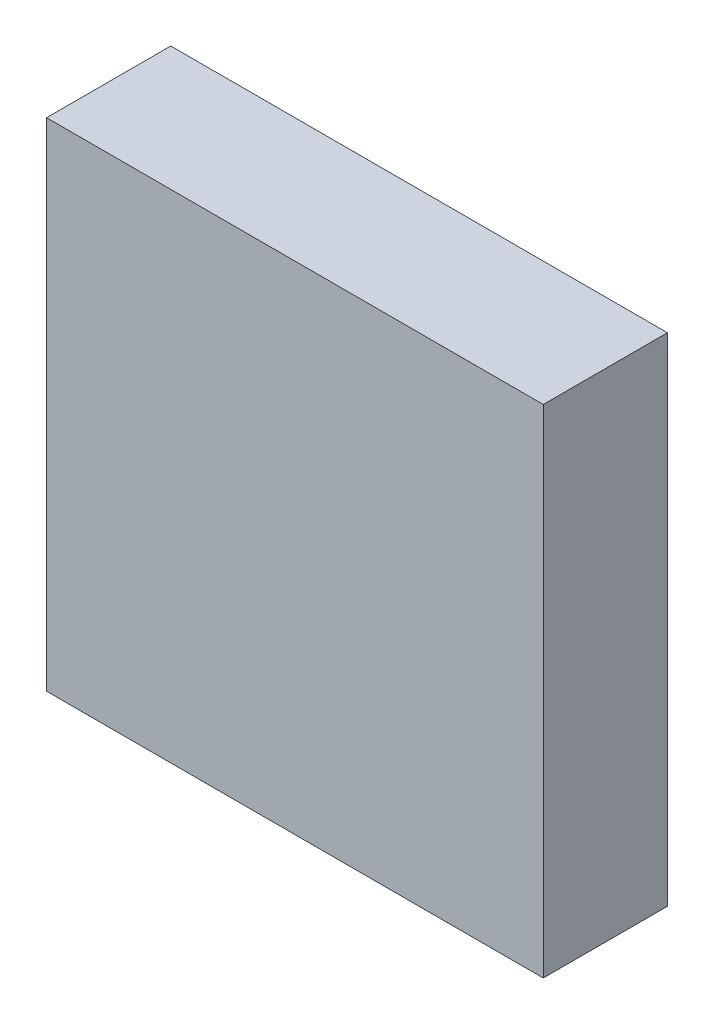
ISO-10303-21;
HEADER;
FILE_DESCRIPTION(('STEP AP214'),'2;1');
FILE_NAME('part.step','',(''),(''),'','','');
FILE_SCHEMA(('AUTOMOTIVE_DESIGN { 1 0 10303 214 1 1 1 1 }'));
ENDSEC;
DATA;
#1=APPLICATION_CONTEXT('core data for automotive mechanical design processes');
#2=APPLICATION_PROTOCOL_DEFINITION('international standard','automotive_design',2000,#1);
#3=PRODUCT_CONTEXT('',#1,'mechanical');
#4=PRODUCT('Part','Part','',(#3));
#5=PRODUCT_RELATED_PRODUCT_CATEGORY('part','',(#4));
#6=PRODUCT_DEFINITION_FORMATION('','',#4);
#7=PRODUCT_DEFINITION_CONTEXT('part definition',#1,'design');
#8=PRODUCT_DEFINITION('design','',#6,#7);
#9=PRODUCT_DEFINITION_SHAPE('','',#8);
#10=(LENGTH_UNIT() NAMED_UNIT(*) SI_UNIT(.MILLI.,.METRE.));
#11=(NAMED_UNIT(*) PLANE_ANGLE_UNIT() SI_UNIT($,.RADIAN.));
#12=(NAMED_UNIT(*) SI_UNIT($,.STERADIAN.) SOLID_ANGLE_UNIT());
#13=UNCERTAINTY_MEASURE_WITH_UNIT(LENGTH_MEASURE(1.E-05),#10,'distance_accuracy_value','');
#14=(GEOMETRIC_REPRESENTATION_CONTEXT(3) GLOBAL_UNCERTAINTY_ASSIGNED_CONTEXT((#13)) GLOBAL_UNIT_ASSIGNED_CONTEXT((#10,
#11,#12)) REPRESENTATION_CONTEXT('',''));
#15=CARTESIAN_POINT('',(0.,0.,0.));
#16=DIRECTION('',(0.,0.,1.));
#17=DIRECTION('',(1.,0.,0.));
#18=AXIS2_PLACEMENT_3D('',#15,#16,#17);
#19=CARTESIAN_POINT('',(-1000.,-1000.,500.));
#20=DIRECTION('',(1.,0.,0.));
#21=DIRECTION('',(0.,0.,-1.));
#22=AXIS2_PLACEMENT_3D('',#19,#20,#21);
#23=PLANE('',#22);
#24=DIRECTION('',(0.,-1.,0.));
#25=VECTOR('',#24,1.);
#26=CARTESIAN_POINT('',(-1000.,-1000.,0.));
#27=LINE('',#26,#25);
#28=CARTESIAN_POINT('',(-1000.,999.999999999999,0.));
#29=VERTEX_POINT('',#28);
#30=CARTESIAN_POINT('',(-1000.,-1000.,0.));
#31=VERTEX_POINT('',#30);
#32=EDGE_CURVE('E113',#29,#31,#27,.T.);
#33=ORIENTED_EDGE('',*,*,#32,.T.);
#34=DIRECTION('',(0.,0.,-1.));
#35=VECTOR('',#34,1.);
#36=CARTESIAN_POINT('',(-1000.,-1000.,500.));
#37=LINE('',#36,#35);
#38=CARTESIAN_POINT('',(-1000.,-1000.,500.));
#39=VERTEX_POINT('',#38);
#40=EDGE_CURVE('E11',#39,#31,#37,.T.);
#41=ORIENTED_EDGE('',*,*,#40,.F.);
#42=DIRECTION('',(0.,-1.,0.));
#43=VECTOR('',#42,1.);
#44=CARTESIAN_POINT('',(-1000.,-1000.,500.));
#45=LINE('',#44,#43);
#46=CARTESIAN_POINT('',(-1000.,999.999999999999,500.));
#47=VERTEX_POINT('',#46);
#48=EDGE_CURVE('E97',#47,#39,#45,.T.);
#49=ORIENTED_EDGE('',*,*,#48,.F.);
#50=DIRECTION('',(0.,0.,-1.));
#51=VECTOR('',#50,1.);
#52=CARTESIAN_POINT('',(-1000.,999.999999999999,500.));
#53=LINE('',#52,#51);
#54=EDGE_CURVE('E109',#47,#29,#53,.T.);
#55=ORIENTED_EDGE('',*,*,#54,.T.);
#56=EDGE_LOOP('',(#33,#41,#49,#55));
#57=FACE_BOUND('',#56,.T.);
#58=ADVANCED_FACE('F45',(#57),#23,.F.);
#59=CARTESIAN_POINT('',(1000.,-1000.,500.));
#60=DIRECTION('',(0.,1.,0.));
#61=DIRECTION('',(-1.,0.,0.));
#62=AXIS2_PLACEMENT_3D('',#59,#60,#61);
#63=PLANE('',#62);
#64=DIRECTION('',(1.,0.,0.));
#65=VECTOR('',#64,1.);
#66=CARTESIAN_POINT('',(1000.,-1000.,0.));
#67=LINE('',#66,#65);
#68=CARTESIAN_POINT('',(1000.,-1000.,0.));
#69=VERTEX_POINT('',#68);
#70=EDGE_CURVE('E102',#31,#69,#67,.T.);
#71=ORIENTED_EDGE('',*,*,#70,.T.);
#72=DIRECTION('',(0.,0.,-1.));
#73=VECTOR('',#72,1.);
#74=CARTESIAN_POINT('',(1000.,-1000.,500.));
#75=LINE('',#74,#73);
#76=CARTESIAN_POINT('',(1000.,-1000.,500.));
#77=VERTEX_POINT('',#76);
#78=EDGE_CURVE('E54',#77,#69,#75,.T.);
#79=ORIENTED_EDGE('',*,*,#78,.F.);
#80=DIRECTION('',(1.,0.,0.));
#81=VECTOR('',#80,1.);
#82=CARTESIAN_POINT('',(1000.,-1000.,500.));
#83=LINE('',#82,#81);
#84=EDGE_CURVE('E92',#39,#77,#83,.T.);
#85=ORIENTED_EDGE('',*,*,#84,.F.);
#86=ORIENTED_EDGE('',*,*,#40,.T.);
#87=EDGE_LOOP('',(#71,#79,#85,#86));
#88=FACE_BOUND('',#87,.T.);
#89=ADVANCED_FACE('F101',(#88),#63,.F.);
#90=CARTESIAN_POINT('',(1000.,-1000.,500.));
#91=DIRECTION('',(-1.,0.,0.));
#92=DIRECTION('',(0.,0.,1.));
#93=AXIS2_PLACEMENT_3D('',#90,#91,#92);
#94=PLANE('',#93);
#95=DIRECTION('',(0.,1.,0.));
#96=VECTOR('',#95,1.);
#97=CARTESIAN_POINT('',(1000.,-1000.,0.));
#98=LINE('',#97,#96);
#99=CARTESIAN_POINT('',(1000.,1000.,0.));
#100=VERTEX_POINT('',#99);
#101=EDGE_CURVE('E79',#69,#100,#98,.T.);
#102=ORIENTED_EDGE('',*,*,#101,.T.);
#103=DIRECTION('',(0.,0.,-1.));
#104=VECTOR('',#103,1.);
#105=CARTESIAN_POINT('',(1000.,1000.,500.));
#106=LINE('',#105,#104);
#107=CARTESIAN_POINT('',(1000.,1000.,500.));
#108=VERTEX_POINT('',#107);
#109=EDGE_CURVE('E104',#108,#100,#106,.T.);
#110=ORIENTED_EDGE('',*,*,#109,.F.);
#111=DIRECTION('',(0.,1.,0.));
#112=VECTOR('',#111,1.);
#113=CARTESIAN_POINT('',(1000.,-1000.,500.));
#114=LINE('',#113,#112);
#115=EDGE_CURVE('E95',#77,#108,#114,.T.);
#116=ORIENTED_EDGE('',*,*,#115,.F.);
#117=ORIENTED_EDGE('',*,*,#78,.T.);
#118=EDGE_LOOP('',(#102,#110,#116,#117));
#119=FACE_BOUND('',#118,.T.);
#120=ADVANCED_FACE('F105',(#119),#94,.F.);
#121=CARTESIAN_POINT('',(1000.,1000.,500.));
#122=DIRECTION('',(0.,-1.,0.));
#123=DIRECTION('',(1.,0.,0.));
#124=AXIS2_PLACEMENT_3D('',#121,#122,#123);
#125=PLANE('',#124);
#126=DIRECTION('',(-1.,0.,0.));
#127=VECTOR('',#126,1.);
#128=CARTESIAN_POINT('',(1000.,1000.,0.));
#129=LINE('',#128,#127);
#130=EDGE_CURVE('E85',#100,#29,#129,.T.);
#131=ORIENTED_EDGE('',*,*,#130,.T.);
#132=ORIENTED_EDGE('',*,*,#54,.F.);
#133=DIRECTION('',(-1.,0.,0.));
#134=VECTOR('',#133,1.);
#135=CARTESIAN_POINT('',(1000.,1000.,500.));
#136=LINE('',#135,#134);
#137=EDGE_CURVE('E62',#108,#47,#136,.T.);
#138=ORIENTED_EDGE('',*,*,#137,.F.);
#139=ORIENTED_EDGE('',*,*,#109,.T.);
#140=EDGE_LOOP('',(#131,#132,#138,#139));
#141=FACE_BOUND('',#140,.T.);
#142=ADVANCED_FACE('F126',(#141),#125,.F.);
#143=CARTESIAN_POINT('',(0.,0.,500.));
#144=DIRECTION('',(0.,0.,1.));
#145=DIRECTION('',(1.,0.,0.));
#146=AXIS2_PLACEMENT_3D('',#143,#144,#145);
#147=PLANE('',#146);
#148=ORIENTED_EDGE('',*,*,#48,.T.);
#149=ORIENTED_EDGE('',*,*,#84,.T.);
#150=ORIENTED_EDGE('',*,*,#115,.T.);
#151=ORIENTED_EDGE('',*,*,#137,.T.);
#152=EDGE_LOOP('',(#148,#149,#150,#151));
#153=FACE_BOUND('',#152,.T.);
#154=ADVANCED_FACE('F93',(#153),#147,.T.);
#155=CARTESIAN_POINT('',(0.,0.,0.));
#156=DIRECTION('',(0.,0.,1.));
#157=DIRECTION('',(1.,0.,0.));
#158=AXIS2_PLACEMENT_3D('',#155,#156,#157);
#159=PLANE('',#158);
#160=ORIENTED_EDGE('',*,*,#32,.F.);
#161=ORIENTED_EDGE('',*,*,#130,.F.);
#162=ORIENTED_EDGE('',*,*,#101,.F.);
#163=ORIENTED_EDGE('',*,*,#70,.F.);
#164=EDGE_LOOP('',(#160,#161,#162,#163));
#165=FACE_BOUND('',#164,.T.);
#166=ADVANCED_FACE('F129',(#165),#159,.F.);
#167=CLOSED_SHELL('',(#58,#89,#120,#142,#154,#166));
#168=MANIFOLD_SOLID_BREP('B2',#167);
#169=ADVANCED_BREP_SHAPE_REPRESENTATION('',(#18,#168),#14);
#170=SHAPE_DEFINITION_REPRESENTATION(#9,#169);
ENDSEC;
END-ISO-10303-21;
